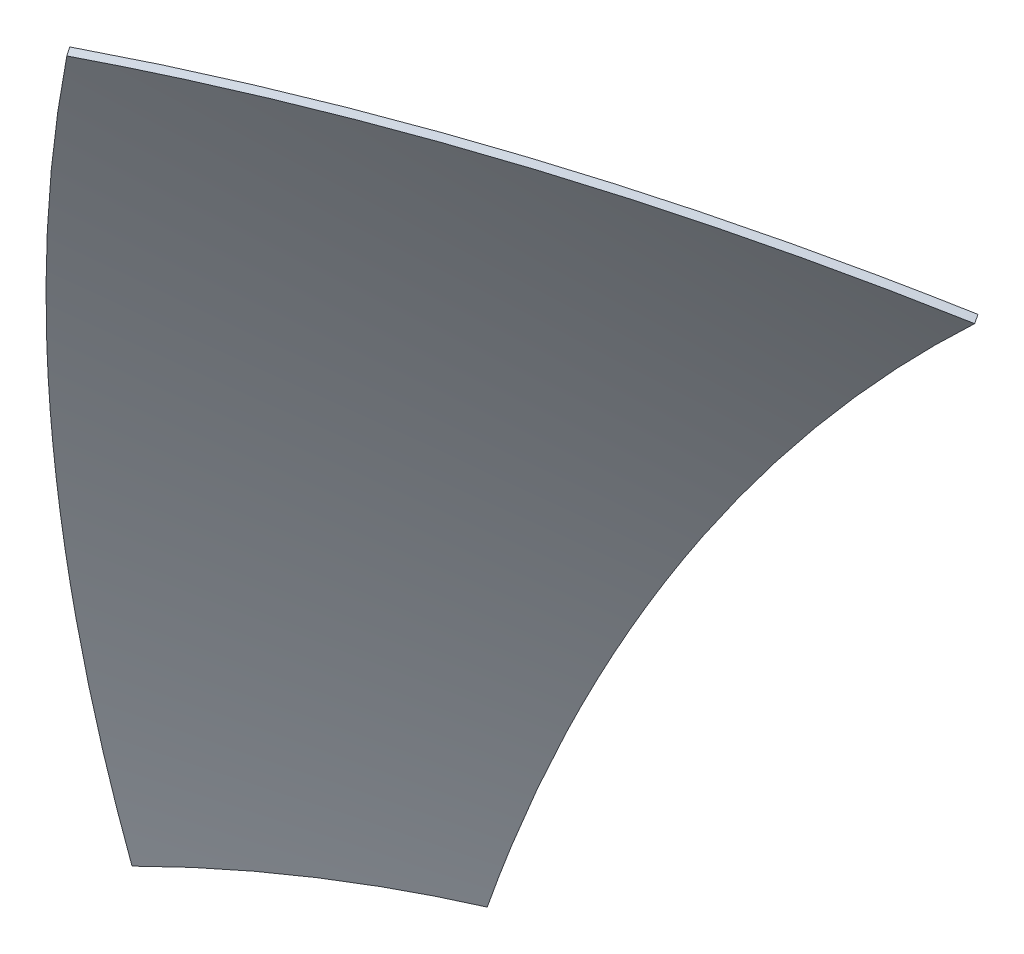
ISO-10303-21;
HEADER;
FILE_DESCRIPTION(('STEP AP214'),'2;1');
FILE_NAME('part.step','',(''),(''),'','','');
FILE_SCHEMA(('AUTOMOTIVE_DESIGN { 1 0 10303 214 1 1 1 1 }'));
ENDSEC;
DATA;
#1=APPLICATION_CONTEXT('core data for automotive mechanical design processes');
#2=APPLICATION_PROTOCOL_DEFINITION('international standard','automotive_design',2000,#1);
#3=PRODUCT_CONTEXT('',#1,'mechanical');
#4=PRODUCT('Part','Part','',(#3));
#5=PRODUCT_RELATED_PRODUCT_CATEGORY('part','',(#4));
#6=PRODUCT_DEFINITION_FORMATION('','',#4);
#7=PRODUCT_DEFINITION_CONTEXT('part definition',#1,'design');
#8=PRODUCT_DEFINITION('design','',#6,#7);
#9=PRODUCT_DEFINITION_SHAPE('','',#8);
#10=(LENGTH_UNIT() NAMED_UNIT(*) SI_UNIT(.MILLI.,.METRE.));
#11=(NAMED_UNIT(*) PLANE_ANGLE_UNIT() SI_UNIT($,.RADIAN.));
#12=(NAMED_UNIT(*) SI_UNIT($,.STERADIAN.) SOLID_ANGLE_UNIT());
#13=UNCERTAINTY_MEASURE_WITH_UNIT(LENGTH_MEASURE(1.E-05),#10,'distance_accuracy_value','');
#14=(GEOMETRIC_REPRESENTATION_CONTEXT(3) GLOBAL_UNCERTAINTY_ASSIGNED_CONTEXT((#13)) GLOBAL_UNIT_ASSIGNED_CONTEXT((#10,
#11,#12)) REPRESENTATION_CONTEXT('',''));
#15=CARTESIAN_POINT('',(0.,0.,0.));
#16=DIRECTION('',(0.,0.,1.));
#17=DIRECTION('',(1.,0.,0.));
#18=AXIS2_PLACEMENT_3D('',#15,#16,#17);
#19=CARTESIAN_POINT('',(172.872009727475,-136.100050866255,-2.70380006520976));
#20=DIRECTION('',(0.,0.,1.));
#21=DIRECTION('',(1.,0.,0.));
#22=AXIS2_PLACEMENT_3D('',#19,#20,#21);
#23=CONICAL_SURFACE('',#22,60.5897364806193,0.959931088596881);
#24=CARTESIAN_POINT('',(125.849998580381,-98.0097647694244,-2.75685890943693));
#25=CARTESIAN_POINT('',(125.802806108054,-98.13289418441,-2.78545031005122));
#26=CARTESIAN_POINT('',(125.756061819432,-98.2561868985266,-2.81408465069162));
#27=CARTESIAN_POINT('',(125.524566386262,-98.8734953138719,-2.95747722445125));
#28=CARTESIAN_POINT('',(125.346546683373,-99.3699071881128,-3.07286594452157));
#29=CARTESIAN_POINT('',(125.004930350756,-100.36738299773,-3.30487100261232));
#30=CARTESIAN_POINT('',(124.841333705168,-100.868446927991,-3.42148733928278));
#31=CARTESIAN_POINT('',(124.606824293059,-101.623178408865,-3.5972582691083));
#32=CARTESIAN_POINT('',(124.530471383772,-101.875268739663,-3.6559874514854));
#33=CARTESIAN_POINT('',(124.30684921741,-102.633106619988,-3.83260237197292));
#34=CARTESIAN_POINT('',(124.165028565446,-103.140384167133,-3.95090689832531));
#35=CARTESIAN_POINT('',(123.963299347978,-103.903964340939,-4.12913701152559));
#36=CARTESIAN_POINT('',(123.897892108323,-104.158925603039,-4.18867372985469));
#37=CARTESIAN_POINT('',(123.70717305496,-104.925148816877,-4.36768239152716));
#38=CARTESIAN_POINT('',(123.587374397705,-105.437712673303,-4.48754409217228));
#39=CARTESIAN_POINT('',(123.41882289238,-106.208763313568,-4.66806910878462));
#40=CARTESIAN_POINT('',(123.364498601842,-106.466138137804,-4.72836395494921));
#41=CARTESIAN_POINT('',(123.20712062133,-107.239367754705,-4.90963681962026));
#42=CARTESIAN_POINT('',(123.109670786163,-107.756289353954,-5.03099420236332));
#43=CARTESIAN_POINT('',(122.929747551783,-108.792507583427,-5.2746148598781));
#44=CARTESIAN_POINT('',(122.847274135357,-109.31180421092,-5.39687813360849));
#45=CARTESIAN_POINT('',(122.697256368376,-110.35236790928,-5.64218186063622));
#46=CARTESIAN_POINT('',(122.629712001331,-110.87363497797,-5.76522231307498));
#47=CARTESIAN_POINT('',(122.509545516411,-111.917726239524,-6.01197519331244));
#48=CARTESIAN_POINT('',(122.456923387982,-112.440550431287,-6.1356876206358));
#49=CARTESIAN_POINT('',(122.36660567934,-113.487348977098,-6.38369158076698));
#50=CARTESIAN_POINT('',(122.328910094295,-114.011323330773,-6.50798311338728));
#51=CARTESIAN_POINT('',(122.268469203174,-115.060015587452,-6.75706856771514));
#52=CARTESIAN_POINT('',(122.245723897837,-115.584733490493,-6.88186248944746));
#53=CARTESIAN_POINT('',(122.21522140697,-116.634497066446,-7.13188680947868));
#54=CARTESIAN_POINT('',(122.207464227664,-117.159542739494,-7.25711720795879));
#55=CARTESIAN_POINT('',(122.206854047819,-118.540491045691,-7.58703759582123));
#56=CARTESIAN_POINT('',(122.226477590711,-119.396334529808,-7.79205750479719));
#57=CARTESIAN_POINT('',(122.266237781076,-120.251218893401,-7.99752302693634));
#58=B_SPLINE_CURVE_WITH_KNOTS('',3,(#24,#25,#26,#27,#28,#29,#30,#31,#32,#33,#34,#35,#36,#37,#38,
#39,#40,#41,#42,#43,#44,#45,#46,#47,#48,#49,#50,#51,#52,#53,#54,#55,#56,#57),.UNSPECIFIED.,.F.,
.F.,(4,2,2,2,2,2,2,2,2,2,2,2,2,2,2,2,4),(0.,0.404785719259704,2.02408034318521,3.64337318660384,
4.45295943477973,6.07225112742958,6.8818373497473,8.50112955325486,9.31071594741061,
10.930009830607,12.5493018526975,14.168592086213,15.7878811744452,17.407169738383,
19.0264583821332,20.6457476982453,23.2857198233411),.UNSPECIFIED.);
#59=CARTESIAN_POINT('',(125.849998580381,-98.0097647694244,-2.75685890943717));
#60=VERTEX_POINT('',#59);
#61=CARTESIAN_POINT('',(122.266237781076,-120.251218893401,-7.99752302693643));
#62=VERTEX_POINT('',#61);
#63=EDGE_CURVE('E24',#60,#62,#58,.T.);
#64=ORIENTED_EDGE('',*,*,#63,.T.);
#65=CARTESIAN_POINT('',(122.266237781076,-120.251218893401,-7.99752302693644));
#66=CARTESIAN_POINT('',(122.378834222942,-120.230350592133,-8.06839270908249));
#67=CARTESIAN_POINT('',(122.491517403282,-120.210827804477,-8.13954595753023));
#68=CARTESIAN_POINT('',(123.055555490295,-120.119817129517,-8.49686090490556));
#69=CARTESIAN_POINT('',(123.507782583896,-120.068331067844,-8.78704423252385));
#70=CARTESIAN_POINT('',(124.223882396153,-120.019047829316,-9.25266430868717));
#71=CARTESIAN_POINT('',(124.488351616915,-120.00785558515,-9.4259560292551));
#72=CARTESIAN_POINT('',(124.864628902835,-120.001724665476,-9.67445744911121));
#73=CARTESIAN_POINT('',(124.97689869284,-120.001143352245,-9.74885104371517));
#74=CARTESIAN_POINT('',(125.475564833004,-120.004076503657,-10.0804026850154));
#75=CARTESIAN_POINT('',(125.860747708995,-120.021087853066,-10.3394946224087));
#76=CARTESIAN_POINT('',(126.35460444555,-120.061763817469,-10.6757424971132));
#77=CARTESIAN_POINT('',(126.465478529002,-120.072134833643,-10.7514987942407));
#78=CARTESIAN_POINT('',(126.949766163138,-120.122874819221,-11.083580757449));
#79=CARTESIAN_POINT('',(127.320934199319,-120.175962365991,-11.3411894895934));
#80=CARTESIAN_POINT('',(127.689117275119,-120.24301357727,-11.5999996128498));
#81=B_SPLINE_CURVE_WITH_KNOTS('',3,(#65,#66,#67,#68,#69,#70,#71,#72,#73,#74,#75,#76,#77,#78,#79,
#80),.UNSPECIFIED.,.F.,.F.,(4,2,2,2,2,2,2,4),(0.,0.404039967201591,2.02138933713423,
2.97026784667452,3.37430460638402,4.76665393129961,5.17069019074547,6.53488990231731),.UNSPECIFIED.);
#82=CARTESIAN_POINT('',(127.689117277392,-120.243013577684,-11.5999996144474));
#83=VERTEX_POINT('',#82);
#84=EDGE_CURVE('E119',#62,#83,#81,.T.);
#85=ORIENTED_EDGE('',*,*,#84,.T.);
#86=CARTESIAN_POINT('',(127.68911727943,-120.243013578765,-11.599999616045));
#87=CARTESIAN_POINT('',(127.734249352296,-120.114414370192,-11.5999996494661));
#88=CARTESIAN_POINT('',(127.779938252751,-119.986008045044,-11.6000047399863));
#89=CARTESIAN_POINT('',(128.011179527202,-119.344894596544,-11.6000530761268));
#90=CARTESIAN_POINT('',(128.205047341229,-118.835157335904,-11.6001649766074));
#91=CARTESIAN_POINT('',(128.610185232068,-117.822665557507,-11.6004735845135));
#92=CARTESIAN_POINT('',(128.821455285935,-117.319911030543,-11.6006702918273));
#93=CARTESIAN_POINT('',(129.261087085438,-116.321926930714,-11.6010958966154));
#94=CARTESIAN_POINT('',(129.489448812089,-115.826697349492,-11.6013247940541));
#95=CARTESIAN_POINT('',(129.96293679863,-114.844325152598,-11.6017712994756));
#96=CARTESIAN_POINT('',(130.208063043527,-114.357182529694,-11.6019889074686));
#97=CARTESIAN_POINT('',(130.714762263948,-113.391511599134,-11.602378996813));
#98=CARTESIAN_POINT('',(130.976335228427,-112.912983285692,-11.6025514781948));
#99=CARTESIAN_POINT('',(131.380740406832,-112.202123789558,-11.6027589088285));
#100=CARTESIAN_POINT('',(131.517541995298,-111.966338741817,-11.6028195019009));
#101=CARTESIAN_POINT('',(131.933963088842,-111.2624508287,-11.6029726866687));
#102=CARTESIAN_POINT('',(132.219570646563,-110.797866918605,-11.603036664634));
#103=CARTESIAN_POINT('',(132.806377590582,-109.878674419631,-11.6030799623007));
#104=CARTESIAN_POINT('',(133.107576975348,-109.424065829771,-11.6030592820104));
#105=CARTESIAN_POINT('',(133.725243721685,-108.525319356074,-11.6029358242954));
#106=CARTESIAN_POINT('',(134.041711085293,-108.081181473635,-11.6028330468597));
#107=CARTESIAN_POINT('',(134.527550376957,-107.423287256838,-11.6026274061342));
#108=CARTESIAN_POINT('',(134.691344029307,-107.205386170222,-11.6025502856886));
#109=CARTESIAN_POINT('',(135.188295663674,-106.555844505934,-11.6022970817994));
#110=CARTESIAN_POINT('',(135.526989914516,-106.128413814873,-11.602099167825));
#111=CARTESIAN_POINT('',(136.218737103603,-105.285355659203,-11.6016733387507));
#112=CARTESIAN_POINT('',(136.571790051981,-104.869728202923,-11.6014454236294));
#113=CARTESIAN_POINT('',(137.291906994172,-104.050770040237,-11.6009981951405));
#114=CARTESIAN_POINT('',(137.658971000982,-103.64743934524,-11.6007788817808));
#115=CARTESIAN_POINT('',(138.219736601336,-103.052111604913,-11.6004924206064));
#116=CARTESIAN_POINT('',(138.408342783616,-102.855290931392,-11.6004040220396));
#117=CARTESIAN_POINT('',(139.080108514551,-102.166221744012,-11.600129637712));
#118=CARTESIAN_POINT('',(139.572336531949,-101.682803842599,-11.6000013307997));
#119=CARTESIAN_POINT('',(140.074997158891,-101.210290648039,-11.5999996160448));
#120=B_SPLINE_CURVE_WITH_KNOTS('',3,(#86,#87,#88,#89,#90,#91,#92,#93,#94,#95,#96,#97,#98,#99,
#100,#101,#102,#103,#104,#105,#106,#107,#108,#109,#110,#111,#112,#113,#114,#115,#116,#117,#118,
#119),.UNSPECIFIED.,.F.,.F.,(4,2,2,2,2,2,2,2,2,2,2,2,2,2,2,2,4),(0.,0.408872020829397,
2.04458807106748,3.68030196459463,5.31601404114307,6.95172465472125,8.58743416988309,
9.40520007344816,11.0409086399157,12.6766170456451,14.3123256695421,15.1300915994072,
16.7658012573591,18.4015120695543,20.0372243991629,20.8549909248611,22.9242005441195),.UNSPECIFIED.);
#121=CARTESIAN_POINT('',(140.074997162066,-101.210290630445,-11.5999996085914));
#122=VERTEX_POINT('',#121);
#123=EDGE_CURVE('E69',#83,#122,#120,.T.);
#124=ORIENTED_EDGE('',*,*,#123,.T.);
#125=CARTESIAN_POINT('',(140.074997165241,-101.210290612852,-11.599999601138));
#126=CARTESIAN_POINT('',(139.971671846861,-101.164192572873,-11.5269277914604));
#127=CARTESIAN_POINT('',(139.868101465494,-101.118535482946,-11.4539216044304));
#128=CARTESIAN_POINT('',(139.556638478958,-100.982909679447,-11.2350972452105));
#129=CARTESIAN_POINT('',(139.348010107883,-100.894293781359,-11.0894847203606));
#130=CARTESIAN_POINT('',(139.033579860466,-100.764188168887,-10.8715020800617));
#131=CARTESIAN_POINT('',(138.928514490968,-100.721286459424,-10.7989088714516));
#132=CARTESIAN_POINT('',(138.717892296498,-100.636437223275,-10.653873130143));
#133=CARTESIAN_POINT('',(138.612335462439,-100.594489714315,-10.5814306002664));
#134=CARTESIAN_POINT('',(138.294404263008,-100.4699239803,-10.3639898982521));
#135=CARTESIAN_POINT('',(138.081279628189,-100.388794046213,-10.2192325775908));
#136=CARTESIAN_POINT('',(137.653173728724,-100.230397184013,-9.93034209685028));
#137=CARTESIAN_POINT('',(137.438192407357,-100.153130374411,-9.78620895604294));
#138=CARTESIAN_POINT('',(137.006595100958,-100.00214775947,-9.49848796829979));
#139=CARTESIAN_POINT('',(136.789978978452,-99.9284322567019,-9.35490016878374));
#140=CARTESIAN_POINT('',(136.355062537288,-99.7848411847027,-9.0683571515393));
#141=CARTESIAN_POINT('',(136.136762229392,-99.7149655909574,-8.92540192977787));
#142=CARTESIAN_POINT('',(135.698464684269,-99.5792569327572,-8.640182332777));
#143=CARTESIAN_POINT('',(135.478467480166,-99.5134237896202,-8.49791794414089));
#144=CARTESIAN_POINT('',(135.036805261365,-99.3859207099215,-8.21411679592477));
#145=CARTESIAN_POINT('',(134.81514023296,-99.324250807618,-8.07258004234117));
#146=CARTESIAN_POINT('',(134.147817489284,-99.1455108858595,-7.64910400827855));
#147=CARTESIAN_POINT('',(133.699767531944,-99.0346906461966,-7.36825694497205));
#148=CARTESIAN_POINT('',(133.024093881958,-98.8809512207299,-6.94954878843575));
#149=CARTESIAN_POINT('',(132.798543393421,-98.8318382406183,-6.81057234613201));
#150=CARTESIAN_POINT('',(132.346159857238,-98.7377237111563,-6.53337345461164));
#151=CARTESIAN_POINT('',(132.119326959107,-98.6927216925994,-6.39515092104481));
#152=CARTESIAN_POINT('',(131.436963130596,-98.5638821209821,-5.98159082117687));
#153=CARTESIAN_POINT('',(130.979577557827,-98.4862134382851,-5.70736725357982));
#154=CARTESIAN_POINT('',(130.060445422101,-98.3475534414437,-5.16201669513596));
#155=CARTESIAN_POINT('',(129.598698849129,-98.2865621656057,-4.89088971140309));
#156=CARTESIAN_POINT('',(128.903254804394,-98.2078885089676,-4.48668140266594));
#157=CARTESIAN_POINT('',(128.67098100464,-98.1838003758082,-4.35236558823702));
#158=CARTESIAN_POINT('',(128.009864117983,-98.1215212748924,-3.97199692736606));
#159=CARTESIAN_POINT('',(127.579942357154,-98.0885005405691,-3.72694476190712));
#160=CARTESIAN_POINT('',(126.717046603895,-98.0376117571303,-3.23966310089245));
#161=CARTESIAN_POINT('',(126.284070000175,-98.0197588173004,-2.99743665642981));
#162=CARTESIAN_POINT('',(125.849998580381,-98.0097647694243,-2.75685890943753));
#163=B_SPLINE_CURVE_WITH_KNOTS('',3,(#125,#126,#127,#128,#129,#130,#131,#132,#133,#134,#135,
#136,#137,#138,#139,#140,#141,#142,#143,#144,#145,#146,#147,#148,#149,#150,#151,#152,#153,#154,
#155,#156,#157,#158,#159,#160,#161,#162),.UNSPECIFIED.,.F.,.F.,(4,2,2,2,2,2,2,2,2,2,2,2,2,2,2,2,
2,2,4),(0.,0.404064073645264,1.21225538975873,1.61640711270501,2.0205663373726,2.83085305035249,
3.64116460560685,4.45154507775997,5.26192037582597,6.07227989579173,6.8826460832132,
8.50313977573195,9.31144165049465,10.1196511537601,11.7361078506468,13.3525682603534,
14.1607183797807,15.6483280666406,17.1374178931225),.UNSPECIFIED.);
#164=EDGE_CURVE('E66',#122,#60,#163,.T.);
#165=ORIENTED_EDGE('',*,*,#164,.T.);
#166=EDGE_LOOP('',(#64,#85,#124,#165));
#167=FACE_BOUND('',#166,.T.);
#168=ADVANCED_FACE('F17',(#167),#23,.F.);
#169=CARTESIAN_POINT('',(122.155670900579,-120.216591303635,-8.16299173988276));
#170=CARTESIAN_POINT('',(122.156035807775,-120.216705586109,-8.1624456385199));
#171=CARTESIAN_POINT('',(122.156400714972,-120.216819868584,-8.16189953715704));
#172=CARTESIAN_POINT('',(122.156765622168,-120.216934151058,-8.16135343579418));
#173=CARTESIAN_POINT('',(122.193256341804,-120.228362398506,-8.10674329950825));
#174=CARTESIAN_POINT('',(122.22974706144,-120.239790645953,-8.05213316322232));
#175=CARTESIAN_POINT('',(122.266237781076,-120.251218893401,-7.99752302693639));
#176=CARTESIAN_POINT('',(121.957949452135,-115.901699881147,-7.12789737510281));
#177=CARTESIAN_POINT('',(121.958305630485,-115.901842049585,-7.12735127373995));
#178=CARTESIAN_POINT('',(121.958661808835,-115.901984218022,-7.12680517237709));
#179=CARTESIAN_POINT('',(121.959017987185,-115.90212638646,-7.12625907101423));
#180=CARTESIAN_POINT('',(121.994635822177,-115.916343230233,-7.0716489347283));
#181=CARTESIAN_POINT('',(122.030254068203,-115.93055440918,-7.01703879844237));
#182=CARTESIAN_POINT('',(122.065871903196,-115.944771252953,-6.96242866215644));
#183=CARTESIAN_POINT('',(122.509266157602,-108.239848419767,-5.31571933886036));
#184=CARTESIAN_POINT('',(122.509601950313,-108.24003598325,-5.3151732374975));
#185=CARTESIAN_POINT('',(122.509937743023,-108.240223546734,-5.31462713613464));
#186=CARTESIAN_POINT('',(122.510273535734,-108.240411110218,-5.31408103477178));
#187=CARTESIAN_POINT('',(122.543852806785,-108.259167458594,-5.25947089848585));
#188=CARTESIAN_POINT('',(122.577431670557,-108.277926071453,-5.20486076219992));
#189=CARTESIAN_POINT('',(122.611010941608,-108.296682419828,-5.15025062591399));
#190=CARTESIAN_POINT('',(124.610925355273,-100.929744474195,-3.61624611019748));
#191=CARTESIAN_POINT('',(124.611234587475,-100.929970225461,-3.61570000883462));
#192=CARTESIAN_POINT('',(124.611543819676,-100.930195976728,-3.61515390747176));
#193=CARTESIAN_POINT('',(124.611853051878,-100.930421727995,-3.6146078061089));
#194=CARTESIAN_POINT('',(124.64277627205,-100.952996854675,-3.55999766982297));
#195=CARTESIAN_POINT('',(124.673699727548,-100.975571198893,-3.50538753353703));
#196=CARTESIAN_POINT('',(124.704622947719,-100.998146325572,-3.4507773972511));
#197=CARTESIAN_POINT('',(125.759968364243,-97.9368355899539,-2.92232762238331));
#198=CARTESIAN_POINT('',(125.76026549367,-97.9370762803152,-2.92178152102045));
#199=CARTESIAN_POINT('',(125.760562623096,-97.9373169706765,-2.92123541965759));
#200=CARTESIAN_POINT('',(125.760859752522,-97.9375576610378,-2.92068931829473));
#201=CARTESIAN_POINT('',(125.790572695142,-97.9616266971667,-2.8660791820088));
#202=CARTESIAN_POINT('',(125.820285637761,-97.9856957332955,-2.81146904572286));
#203=CARTESIAN_POINT('',(125.849998580381,-98.0097647694244,-2.75685890943693));
#204=B_SPLINE_SURFACE_WITH_KNOTS('',3,3,((#169,#170,#171,#172,#173,#174,#175),(#176,#177,#178,
#179,#180,#181,#182),(#183,#184,#185,#186,#187,#188,#189),(#190,#191,#192,#193,#194,#195,#196),
(#197,#198,#199,#200,#201,#202,#203)),.UNSPECIFIED.,.F.,.F.,.F.,(4,1,4),(4,3,4),(0.,
0.571428571428571,1.),(-0.01,0.,1.),.UNSPECIFIED.);
#205=DIRECTION('',(0.547360794539463,-0.171423711719821,0.819152044288072));
#206=VECTOR('',#205,1.);
#207=CARTESIAN_POINT('',(122.212049062417,-120.234247945941,-8.078619079321));
#208=LINE('',#207,#206);
#209=CARTESIAN_POINT('',(122.159304545487,-120.217728671679,-8.15755361789322));
#210=VERTEX_POINT('',#209);
#211=EDGE_CURVE('E78',#210,#62,#208,.T.);
#212=DIRECTION('',(-0.445694139286622,0.361035541933279,-0.81915204429123));
#213=VECTOR('',#212,1.);
#214=CARTESIAN_POINT('',(125.805429166452,-97.9736612152311,-2.83877411386609));
#215=LINE('',#214,#213);
#216=CARTESIAN_POINT('',(125.760859743603,-97.937557660841,-2.92068931335484));
#217=VERTEX_POINT('',#216);
#218=EDGE_CURVE('E73',#60,#217,#215,.T.);
#219=CARTESIAN_POINT('',(122.159304516256,-120.217728037305,-8.1575534659389));
#220=CARTESIAN_POINT('',(122.153324246952,-120.087941901877,-8.12646529417039));
#221=CARTESIAN_POINT('',(122.14780794087,-119.958130530187,-8.09538662470399));
#222=CARTESIAN_POINT('',(122.122541537477,-119.308918904987,-7.94003112529178));
#223=CARTESIAN_POINT('',(122.109743619487,-118.789194642967,-7.81590145391037));
#224=CARTESIAN_POINT('',(122.098905478222,-117.74952145904,-7.56799539824963));
#225=CARTESIAN_POINT('',(122.100865240078,-117.229572537359,-7.44421901361446));
#226=CARTESIAN_POINT('',(122.119482001185,-116.18983697441,-7.19705656212203));
#227=CARTESIAN_POINT('',(122.136138990683,-115.670050333035,-7.07367049500585));
#228=CARTESIAN_POINT('',(122.184102769395,-114.631069587072,-6.82735223235055));
#229=CARTESIAN_POINT('',(122.215409553952,-114.111875482296,-6.70442003666719));
#230=CARTESIAN_POINT('',(122.331293199647,-112.555328999155,-6.33629757912645));
#231=CARTESIAN_POINT('',(122.437828047128,-111.519307470136,-6.09185154278126));
#232=CARTESIAN_POINT('',(122.641438036179,-109.970934648462,-5.72736094358116));
#233=CARTESIAN_POINT('',(122.716595623074,-109.455825913936,-5.60624409169105));
#234=CARTESIAN_POINT('',(122.881545038144,-108.427733041591,-5.36481215020711));
#235=CARTESIAN_POINT('',(122.971336883008,-107.914748906196,-5.24449706152774));
#236=CARTESIAN_POINT('',(123.117018955026,-107.147247292086,-5.06474047492168));
#237=CARTESIAN_POINT('',(123.167410014891,-106.891751694755,-5.0049430967766));
#238=CARTESIAN_POINT('',(123.324072904931,-106.126246054495,-4.82589534309327));
#239=CARTESIAN_POINT('',(123.435827933279,-105.617254360738,-4.70699807080837));
#240=CARTESIAN_POINT('',(123.614293078245,-104.856203860931,-4.52939737235408));
#241=CARTESIAN_POINT('',(123.675584465495,-104.602935709137,-4.47032347794018));
#242=CARTESIAN_POINT('',(123.991146973321,-103.338263553802,-4.17546984850457));
#243=CARTESIAN_POINT('',(124.27248273097,-102.332963643998,-3.94149399451808));
#244=CARTESIAN_POINT('',(124.759974802808,-100.763763490638,-3.57668756678388));
#245=CARTESIAN_POINT('',(124.947130197488,-100.194193333045,-3.44436154445767));
#246=CARTESIAN_POINT('',(125.340052604147,-99.0611680040062,-3.18130287676404));
#247=CARTESIAN_POINT('',(125.545818776349,-98.4977125579291,-3.05057015980355));
#248=CARTESIAN_POINT('',(125.760859732681,-97.9375577127195,-2.92068933027751));
#249=B_SPLINE_CURVE_WITH_KNOTS('',3,(#219,#220,#221,#222,#223,#224,#225,#226,#227,#228,#229,
#230,#231,#232,#233,#234,#235,#236,#237,#238,#239,#240,#241,#242,#243,#244,#245,#246,#247,#248),
.UNSPECIFIED.,.F.,.F.,(4,2,2,2,2,2,2,2,2,2,2,2,2,2,4),(0.,0.400777839765909,2.00403361712834,
3.60728777910773,5.21054087728743,6.81379346584936,10.0212073204717,11.6244618026775,
13.2277181131932,14.0292884719849,15.6325454264526,16.4341155511472,19.6415516112059,
21.4831723036834,23.3247099380154),.UNSPECIFIED.);
#250=EDGE_CURVE('E113',#210,#217,#249,.T.);
#251=ORIENTED_EDGE('',*,*,#211,.T.);
#252=ORIENTED_EDGE('',*,*,#63,.F.);
#253=ORIENTED_EDGE('',*,*,#218,.T.);
#254=ORIENTED_EDGE('',*,*,#250,.F.);
#255=EDGE_LOOP('',(#251,#252,#253,#254));
#256=FACE_BOUND('',#255,.T.);
#257=ADVANCED_FACE('F75',(#256),#204,.F.);
#258=CARTESIAN_POINT('',(125.759968364244,-97.9368355899539,-2.92232762238349));
#259=CARTESIAN_POINT('',(125.760265493671,-97.9370762803152,-2.92178152102063));
#260=CARTESIAN_POINT('',(125.760562623097,-97.9373169706765,-2.92123541965777));
#261=CARTESIAN_POINT('',(125.760859752523,-97.9375576610378,-2.92068931829491));
#262=CARTESIAN_POINT('',(125.790572695142,-97.9616266971666,-2.86607918200903));
#263=CARTESIAN_POINT('',(125.820285637762,-97.9856957332955,-2.81146904572315));
#264=CARTESIAN_POINT('',(125.849998580381,-98.0097647694244,-2.75685890943728));
#265=CARTESIAN_POINT('',(125.850298681101,-98.0100078666893,-2.75630734706079));
#266=CARTESIAN_POINT('',(125.850598781822,-98.0102509639542,-2.7557557846843));
#267=CARTESIAN_POINT('',(125.850898882542,-98.0104940612191,-2.75520422230782));
#268=CARTESIAN_POINT('',(128.715320554766,-98.0020094879843,-4.55903629348519));
#269=CARTESIAN_POINT('',(128.715610500469,-98.0022590552341,-4.55849019212233));
#270=CARTESIAN_POINT('',(128.715900446172,-98.002508622484,-4.55794409075947));
#271=CARTESIAN_POINT('',(128.716190391875,-98.0027581897338,-4.55739798939661));
#272=CARTESIAN_POINT('',(128.745184962184,-98.0277149147181,-4.50278785311073));
#273=CARTESIAN_POINT('',(128.774179514774,-98.0526690615698,-4.44817771682483));
#274=CARTESIAN_POINT('',(128.803174085083,-98.0776257865541,-4.39356758053895));
#275=CARTESIAN_POINT('',(128.803466930243,-98.0778778494764,-4.39301601816246));
#276=CARTESIAN_POINT('',(128.803759775403,-98.0781299123988,-4.39246445578598));
#277=CARTESIAN_POINT('',(128.804052620563,-98.0783819753211,-4.39191289340949));
#278=CARTESIAN_POINT('',(132.68372515011,-98.594150604768,-6.90067145038368));
#279=CARTESIAN_POINT('',(132.684005243807,-98.5944111746842,-6.90012534902082));
#280=CARTESIAN_POINT('',(132.684285337504,-98.5946717446004,-6.89957924765796));
#281=CARTESIAN_POINT('',(132.684565431201,-98.5949323145166,-6.8990331462951));
#282=CARTESIAN_POINT('',(132.712574800895,-98.6209893061368,-6.84442301000919));
#283=CARTESIAN_POINT('',(132.740585196888,-98.6470451876773,-6.7898128737233));
#284=CARTESIAN_POINT('',(132.768594566582,-98.6731021792976,-6.73520273743739));
#285=CARTESIAN_POINT('',(132.768877461216,-98.673365354913,-6.7346511750609));
#286=CARTESIAN_POINT('',(132.76916035585,-98.6736285305283,-6.73409961268441));
#287=CARTESIAN_POINT('',(132.769443250484,-98.6738917061437,-6.73354805030793));
#288=CARTESIAN_POINT('',(136.469547168482,-99.747907639557,-9.35521144096392));
#289=CARTESIAN_POINT('',(136.469817817906,-99.7481777896856,-9.35466533960106));
#290=CARTESIAN_POINT('',(136.47008846733,-99.7484479398142,-9.3541192382382));
#291=CARTESIAN_POINT('',(136.470359116754,-99.7487180899428,-9.35357313687534));
#292=CARTESIAN_POINT('',(136.497424059157,-99.7757331028049,-9.29896300058942));
#293=CARTESIAN_POINT('',(136.524487093416,-99.8027502876181,-9.24435286430351));
#294=CARTESIAN_POINT('',(136.551552035819,-99.8297653004802,-9.18974272801759));
#295=CARTESIAN_POINT('',(136.551825391737,-99.8300381521101,-9.1891911656411));
#296=CARTESIAN_POINT('',(136.552098747655,-99.83031100374,-9.18863960326462));
#297=CARTESIAN_POINT('',(136.552372103574,-99.8305838553699,-9.18808804088813));
#298=CARTESIAN_POINT('',(138.40617016468,-100.449425317283,-10.6557977383047));
#299=CARTESIAN_POINT('',(138.406435984249,-100.449700213942,-10.6552516369418));
#300=CARTESIAN_POINT('',(138.406701803818,-100.449975110602,-10.654705535579));
#301=CARTESIAN_POINT('',(138.406967623388,-100.450250007262,-10.6541594342161));
#302=CARTESIAN_POINT('',(138.433549580337,-100.477739673241,-10.5995492979301));
#303=CARTESIAN_POINT('',(138.460133543102,-100.505226820478,-10.5449391616442));
#304=CARTESIAN_POINT('',(138.48671550005,-100.532716486458,-10.4903290253583));
#305=CARTESIAN_POINT('',(138.486983977815,-100.532994132084,-10.4897774629818));
#306=CARTESIAN_POINT('',(138.48725245558,-100.533271777711,-10.4892259006053));
#307=CARTESIAN_POINT('',(138.487520933346,-100.533549423337,-10.4886743382288));
#308=CARTESIAN_POINT('',(139.361180418864,-100.843466999897,-11.3171126533402));
#309=CARTESIAN_POINT('',(139.361443891858,-100.843744133409,-11.3165665519773));
#310=CARTESIAN_POINT('',(139.361707364851,-100.844021266922,-11.3160204506145));
#311=CARTESIAN_POINT('',(139.361970837845,-100.844298400434,-11.3154743492516));
#312=CARTESIAN_POINT('',(139.388318137207,-100.872011751684,-11.2608642129657));
#313=CARTESIAN_POINT('',(139.41466216463,-100.899728933895,-11.2062540766797));
#314=CARTESIAN_POINT('',(139.441009463991,-100.927442285145,-11.1516439403938));
#315=CARTESIAN_POINT('',(139.441275571715,-100.927722189993,-11.1510923780173));
#316=CARTESIAN_POINT('',(139.441541679438,-100.92800209484,-11.1505408156408));
#317=CARTESIAN_POINT('',(139.441807787162,-100.928281999688,-11.1499892532643));
#318=CARTESIAN_POINT('',(139.995640993928,-101.125870800371,-11.7654683091632));
#319=CARTESIAN_POINT('',(139.995902895461,-101.126149413603,-11.7649222078003));
#320=CARTESIAN_POINT('',(139.996164796993,-101.126428026836,-11.7643761064375));
#321=CARTESIAN_POINT('',(139.996426698526,-101.126706640068,-11.7638300050746));
#322=CARTESIAN_POINT('',(140.022616851778,-101.154567963295,-11.7092198687886));
#323=CARTESIAN_POINT('',(140.04880700503,-101.182429286521,-11.6546097325027));
#324=CARTESIAN_POINT('',(140.074997158282,-101.210290609747,-11.5999995962168));
#325=CARTESIAN_POINT('',(140.07526167883,-101.210572009112,-11.5994480338403));
#326=CARTESIAN_POINT('',(140.075526199378,-101.210853408476,-11.5988964714638));
#327=CARTESIAN_POINT('',(140.075790719926,-101.211134807841,-11.5983449090873));
#328=B_SPLINE_SURFACE_WITH_KNOTS('',3,3,((#258,#259,#260,#261,#262,#263,#264,#265,#266,#267),
(#268,#269,#270,#271,#272,#273,#274,#275,#276,#277),(#278,#279,#280,#281,#282,#283,#284,#285,
#286,#287),(#288,#289,#290,#291,#292,#293,#294,#295,#296,#297),(#298,#299,#300,#301,#302,#303,
#304,#305,#306,#307),(#308,#309,#310,#311,#312,#313,#314,#315,#316,#317),(#318,#319,#320,#321,
#322,#323,#324,#325,#326,#327)),.UNSPECIFIED.,.F.,.F.,.F.,(4,1,1,1,4),(4,3,3,4),(0.,
0.571428571428571,0.785714285714286,0.857142857142857,1.),(-0.01,0.,1.,1.0101),.UNSPECIFIED.);
#329=DIRECTION('',(-0.392852299013213,0.417919848175582,-0.819152044287831));
#330=VECTOR('',#329,1.);
#331=CARTESIAN_POINT('',(140.035010033119,-101.167752016015,-11.6833783341684));
#332=LINE('',#331,#330);
#333=CARTESIAN_POINT('',(139.996664016307,-101.12695926321,-11.7633350556306));
#334=VERTEX_POINT('',#333);
#335=EDGE_CURVE('E84',#122,#334,#332,.T.);
#336=CARTESIAN_POINT('',(125.760859734683,-97.9375576606442,-2.92068930841458));
#337=CARTESIAN_POINT('',(125.877495768326,-97.9401314501815,-2.98528436378416));
#338=CARTESIAN_POINT('',(125.994054796951,-97.9432742637817,-3.04999988443977));
#339=CARTESIAN_POINT('',(126.576506665261,-97.9618080451358,-3.37420297603553));
#340=CARTESIAN_POINT('',(127.041175179269,-97.9856544802839,-3.63545947499306));
#341=CARTESIAN_POINT('',(127.968538623493,-98.0507680271909,-4.16211325219261));
#342=CARTESIAN_POINT('',(128.43122506807,-98.0920811070641,-4.42751966416905));
#343=CARTESIAN_POINT('',(129.352933216166,-98.1915883139783,-4.96159957251695));
#344=CARTESIAN_POINT('',(129.811954624066,-98.2497837888839,-5.2302733281066));
#345=CARTESIAN_POINT('',(130.725764974696,-98.3826519183679,-5.77068483079508));
#346=CARTESIAN_POINT('',(131.180554033163,-98.4573241209944,-6.04242249365789));
#347=CARTESIAN_POINT('',(132.085340184196,-98.6228985017275,-6.58883331461116));
#348=CARTESIAN_POINT('',(132.535337746405,-98.7137990733883,-6.86350617961819));
#349=CARTESIAN_POINT('',(133.205680260354,-98.8621384057863,-7.27729574867544));
#350=CARTESIAN_POINT('',(133.428052677152,-98.9135049180718,-7.41533327415779));
#351=CARTESIAN_POINT('',(133.871408104368,-99.0202750661467,-7.69214217601913));
#352=CARTESIAN_POINT('',(134.092390949326,-99.0756791731728,-7.83091363629872));
#353=CARTESIAN_POINT('',(134.532851672455,-99.1905506329548,-8.1091797982114));
#354=CARTESIAN_POINT('',(134.752329494348,-99.250018136756,-8.24867452655162));
#355=CARTESIAN_POINT('',(135.189677017526,-99.3730297817882,-8.52837801089194));
#356=CARTESIAN_POINT('',(135.407546743359,-99.4365738606415,-8.66858675593631));
#357=CARTESIAN_POINT('',(135.841636310715,-99.5676484513459,-8.94968925086475));
#358=CARTESIAN_POINT('',(136.057856161883,-99.6351789398687,-9.0905829967358));
#359=CARTESIAN_POINT('',(136.488633758894,-99.7740703913912,-9.37300743523818));
#360=CARTESIAN_POINT('',(136.703191543235,-99.8454312653605,-9.51453811299517));
#361=CARTESIAN_POINT('',(137.130727592238,-99.9916826568832,-9.79815991733719));
#362=CARTESIAN_POINT('',(137.343705853785,-100.066573181396,-9.94025104502673));
#363=CARTESIAN_POINT('',(137.762702390888,-100.218068057707,-10.2214768433398));
#364=CARTESIAN_POINT('',(137.968762195937,-100.294583713494,-10.3605973425133));
#365=CARTESIAN_POINT('',(138.379050415175,-100.451324514868,-10.6394461785277));
#366=CARTESIAN_POINT('',(138.583278840635,-100.531549637606,-10.7791745116198));
#367=CARTESIAN_POINT('',(138.99010185144,-100.6956388562,-11.0593317068427));
#368=CARTESIAN_POINT('',(139.192694689774,-100.779506354852,-11.1997611106356));
#369=CARTESIAN_POINT('',(139.596051719818,-100.95068327156,-11.4811555075184));
#370=CARTESIAN_POINT('',(139.796815882617,-101.037992743918,-11.6221205090263));
#371=CARTESIAN_POINT('',(139.996663958246,-101.12695911316,-11.7633349512187));
#372=B_SPLINE_CURVE_WITH_KNOTS('',3,(#336,#337,#338,#339,#340,#341,#342,#343,#344,#345,#346,
#347,#348,#349,#350,#351,#352,#353,#354,#355,#356,#357,#358,#359,#360,#361,#362,#363,#364,#365,
#366,#367,#368,#369,#370,#371),.UNSPECIFIED.,.F.,.F.,(4,2,2,2,2,2,2,2,2,2,2,2,2,2,2,2,2,4),(0.,
0.400064411709241,2.00054432741077,3.60526281103819,5.21010944822085,6.81491207040329,
8.41955592121823,9.21970314858392,10.0199439129471,10.820214440205,11.6204727250546,
12.4207263273003,13.2209613371218,14.0211979247838,14.8015691297141,15.5819355284755,
16.3630473438477,17.1441714873972),.UNSPECIFIED.);
#373=EDGE_CURVE('E81',#217,#334,#372,.T.);
#374=ORIENTED_EDGE('',*,*,#218,.F.);
#375=ORIENTED_EDGE('',*,*,#164,.F.);
#376=ORIENTED_EDGE('',*,*,#335,.T.);
#377=ORIENTED_EDGE('',*,*,#373,.F.);
#378=EDGE_LOOP('',(#374,#375,#376,#377));
#379=FACE_BOUND('',#378,.T.);
#380=ADVANCED_FACE('F79',(#379),#328,.F.);
#381=CARTESIAN_POINT('',(139.995023109454,-101.125213562988,-11.7667566683367));
#382=CARTESIAN_POINT('',(139.995490905298,-101.12571120846,-11.7657812485104));
#383=CARTESIAN_POINT('',(139.995958701141,-101.126208853932,-11.7648058286841));
#384=CARTESIAN_POINT('',(139.996426496984,-101.126706499404,-11.7638304088578));
#385=CARTESIAN_POINT('',(140.022616650251,-101.154567822616,-11.7092202725719));
#386=CARTESIAN_POINT('',(140.048806803517,-101.182429145829,-11.6546101362859));
#387=CARTESIAN_POINT('',(140.074996956783,-101.210290469042,-11.6));
#388=CARTESIAN_POINT('',(140.075263536274,-101.210574058729,-11.5994441444389));
#389=CARTESIAN_POINT('',(140.075530115765,-101.210857648416,-11.5988882888778));
#390=CARTESIAN_POINT('',(140.075796695256,-101.211141238103,-11.5983324333166));
#391=CARTESIAN_POINT('',(134.413230620332,-106.372200136559,-11.7667566683367));
#392=CARTESIAN_POINT('',(134.413777925717,-106.372623186725,-11.7657812485104));
#393=CARTESIAN_POINT('',(134.414325231102,-106.373046236891,-11.7648058286841));
#394=CARTESIAN_POINT('',(134.414872536487,-106.373469287057,-11.7638304088578));
#395=CARTESIAN_POINT('',(134.445514133932,-106.397154295909,-11.7092202725719));
#396=CARTESIAN_POINT('',(134.476140942021,-106.420828833341,-11.6546101362859));
#397=CARTESIAN_POINT('',(134.506782539465,-106.444513842193,-11.6));
#398=CARTESIAN_POINT('',(134.507094428493,-106.444754922783,-11.5994441444389));
#399=CARTESIAN_POINT('',(134.507406317522,-106.444996003373,-11.5988882888778));
#400=CARTESIAN_POINT('',(134.50771820655,-106.445237083964,-11.5983324333166));
#401=CARTESIAN_POINT('',(130.115807738452,-112.975821346272,-11.7667566683367));
#402=CARTESIAN_POINT('',(130.116416195066,-112.976150428596,-11.7657812485104));
#403=CARTESIAN_POINT('',(130.11702465168,-112.97647951092,-11.7648058286841));
#404=CARTESIAN_POINT('',(130.117633108294,-112.976808593244,-11.7638304088578));
#405=CARTESIAN_POINT('',(130.151698336133,-112.995232691338,-11.7092202725719));
#406=CARTESIAN_POINT('',(130.185748000197,-113.013647508019,-11.6546101362859));
#407=CARTESIAN_POINT('',(130.219813228036,-113.032071606112,-11.6));
#408=CARTESIAN_POINT('',(130.220159964881,-113.032259137916,-11.5994441444389));
#409=CARTESIAN_POINT('',(130.220506701725,-113.03244666972,-11.5988882888778));
#410=CARTESIAN_POINT('',(130.22085343857,-113.032634201525,-11.5983324333166));
#411=CARTESIAN_POINT('',(127.57894084019,-120.204346910685,-11.7667566683367));
#412=CARTESIAN_POINT('',(127.57958530039,-120.204573085435,-11.7657812485104));
#413=CARTESIAN_POINT('',(127.580229760589,-120.204799260186,-11.7648058286841));
#414=CARTESIAN_POINT('',(127.580874220789,-120.205025434936,-11.7638304088578));
#415=CARTESIAN_POINT('',(127.616955155776,-120.217688119869,-11.7092202725719));
#416=CARTESIAN_POINT('',(127.653036090763,-120.230350804803,-11.6546101362859));
#417=CARTESIAN_POINT('',(127.689117025751,-120.243013489736,-11.6));
#418=CARTESIAN_POINT('',(127.689484279703,-120.243142378333,-11.5994441444389));
#419=CARTESIAN_POINT('',(127.689851533655,-120.24327126693,-11.5988882888778));
#420=CARTESIAN_POINT('',(127.690218787607,-120.243400155527,-11.5983324333166));
#421=B_SPLINE_SURFACE_WITH_KNOTS('',3,3,((#381,#382,#383,#384,#385,#386,#387,#388,#389,#390),
(#391,#392,#393,#394,#395,#396,#397,#398,#399,#400),(#401,#402,#403,#404,#405,#406,#407,#408,
#409,#410),(#411,#412,#413,#414,#415,#416,#417,#418,#419,#420)),.UNSPECIFIED.,.F.,.F.,.F.,(4,4),
(4,3,3,4),(0.,1.),(-0.0178615160599492,0.,1.,1.0101786151606),.UNSPECIFIED.);
#422=DIRECTION('',(-0.541214024815268,0.189940274008486,-0.819152044282891));
#423=VECTOR('',#422,1.);
#424=CARTESIAN_POINT('',(127.635537086764,-120.224209490162,-11.6810956653056));
#425=LINE('',#424,#423);
#426=CARTESIAN_POINT('',(127.582957498205,-120.205756555481,-11.7606773996093));
#427=VERTEX_POINT('',#426);
#428=EDGE_CURVE('E45',#83,#427,#425,.T.);
#429=CARTESIAN_POINT('',(139.996663972093,-101.126959304763,-11.7633350556399));
#430=CARTESIAN_POINT('',(139.897351021417,-101.220295247723,-11.7633558068636));
#431=CARTESIAN_POINT('',(139.798439246083,-101.314061538517,-11.7633809560977));
#432=CARTESIAN_POINT('',(139.305849204323,-101.785074911829,-11.7635263085439));
#433=CARTESIAN_POINT('',(138.918243479468,-102.168712602808,-11.7637052995402));
#434=CARTESIAN_POINT('',(138.156440454641,-102.949052792269,-11.7641272290204));
#435=CARTESIAN_POINT('',(137.782243137111,-103.345755273642,-11.7643701674206));
#436=CARTESIAN_POINT('',(137.04762587685,-104.15172322056,-11.7648675373785));
#437=CARTESIAN_POINT('',(136.687205918911,-104.560988672237,-11.7651219689235));
#438=CARTESIAN_POINT('',(135.980523678473,-105.391557597006,-11.7655989597031));
#439=CARTESIAN_POINT('',(135.63426138338,-105.812861059388,-11.765821518966));
#440=CARTESIAN_POINT('',(134.956246935268,-106.667003528467,-11.7662009936036));
#441=CARTESIAN_POINT('',(134.624494772542,-107.099842527447,-11.7663579090222));
#442=CARTESIAN_POINT('',(134.138062854117,-107.757298406709,-11.7665266172829));
#443=CARTESIAN_POINT('',(133.977793312522,-107.977804432243,-11.7665717419196));
#444=CARTESIAN_POINT('',(133.50258086933,-108.64341492249,-11.7666708248361));
#445=CARTESIAN_POINT('',(133.193269894922,-109.092565161192,-11.7666884745781));
#446=CARTESIAN_POINT('',(132.59005364692,-110.001072674976,-11.7666185410433));
#447=CARTESIAN_POINT('',(132.296148371768,-110.460429949026,-11.7665309577771));
#448=CARTESIAN_POINT('',(131.72406430418,-111.388856404097,-11.7662530005999));
#449=CARTESIAN_POINT('',(131.44588551376,-111.857925586365,-11.7660626266758));
#450=CARTESIAN_POINT('',(131.040704841986,-112.568342791691,-11.7657099629047));
#451=CARTESIAN_POINT('',(130.907666044777,-112.806271098527,-11.7655812332417));
#452=CARTESIAN_POINT('',(130.514598803456,-113.523461985464,-11.7651653301468));
#453=CARTESIAN_POINT('',(130.260649656586,-114.006079699274,-11.7648484640722));
#454=CARTESIAN_POINT('',(129.769325199212,-114.979660534009,-11.764163552086));
#455=CARTESIAN_POINT('',(129.531949900231,-115.470623660735,-11.7637955061387));
#456=CARTESIAN_POINT('',(129.07408250332,-116.460379379605,-11.7630465624787));
#457=CARTESIAN_POINT('',(128.853590420843,-116.959171978915,-11.7626656647542));
#458=CARTESIAN_POINT('',(128.53578421465,-117.712744486882,-11.7621205348351));
#459=CARTESIAN_POINT('',(128.432009447705,-117.964818674578,-11.7619432032774));
#460=CARTESIAN_POINT('',(128.06652141333,-118.87470712658,-11.7613338814415));
#461=CARTESIAN_POINT('',(127.817273993231,-119.537537246888,-11.7609475150589));
#462=CARTESIAN_POINT('',(127.582957823183,-120.205755456903,-11.7606773602364));
#463=B_SPLINE_CURVE_WITH_KNOTS('',3,(#429,#430,#431,#432,#433,#434,#435,#436,#437,#438,#439,
#440,#441,#442,#443,#444,#445,#446,#447,#448,#449,#450,#451,#452,#453,#454,#455,#456,#457,#458,
#459,#460,#461,#462),.UNSPECIFIED.,.F.,.F.,(4,2,2,2,2,2,2,2,2,2,2,2,2,2,2,2,4),(0.,
0.408872008464468,2.04458727494189,3.68030039928518,5.31601171796278,6.9517215815486,
8.58743035104285,9.40519616158367,11.0409039820544,12.6766116369887,14.3123195016573,
15.1300853354816,16.7657942149186,18.401504231511,20.0372157452697,20.8549821666885,
22.9788418860425),.UNSPECIFIED.);
#464=EDGE_CURVE('E36',#334,#427,#463,.T.);
#465=ORIENTED_EDGE('',*,*,#335,.F.);
#466=ORIENTED_EDGE('',*,*,#123,.F.);
#467=ORIENTED_EDGE('',*,*,#428,.T.);
#468=ORIENTED_EDGE('',*,*,#464,.F.);
#469=EDGE_LOOP('',(#465,#466,#467,#468));
#470=FACE_BOUND('',#469,.T.);
#471=ADVANCED_FACE('F138',(#470),#421,.F.);
#472=CARTESIAN_POINT('',(127.633038215874,-120.214511180006,-11.8004941054634));
#473=CARTESIAN_POINT('',(127.669116966757,-120.22718010841,-11.7458839691774));
#474=CARTESIAN_POINT('',(127.705195682416,-120.239849076875,-11.6912738328915));
#475=CARTESIAN_POINT('',(127.741274433297,-120.252518005279,-11.6366636966056));
#476=CARTESIAN_POINT('',(127.741635220806,-120.252644694563,-11.6361175952428));
#477=CARTESIAN_POINT('',(127.741996008315,-120.252771383847,-11.6355714938799));
#478=CARTESIAN_POINT('',(127.742356795824,-120.252898073131,-11.635025392517));
#479=CARTESIAN_POINT('',(127.615650300669,-120.211349294167,-11.7882727442352));
#480=CARTESIAN_POINT('',(127.651729779586,-120.224016141414,-11.7336626079492));
#481=CARTESIAN_POINT('',(127.687809235021,-120.236683015369,-11.6790524716633));
#482=CARTESIAN_POINT('',(127.723888713938,-120.249349862615,-11.6244423353774));
#483=CARTESIAN_POINT('',(127.724249508727,-120.249476531087,-11.6238962340146));
#484=CARTESIAN_POINT('',(127.724610303516,-120.24960319956,-11.6233501326517));
#485=CARTESIAN_POINT('',(127.724971098306,-120.249729868032,-11.6228040312888));
#486=CARTESIAN_POINT('',(127.598262385463,-120.208187408327,-11.776051383007));
#487=CARTESIAN_POINT('',(127.634342592416,-120.220852174417,-11.721441246721));
#488=CARTESIAN_POINT('',(127.670422787627,-120.233516953862,-11.6668311104351));
#489=CARTESIAN_POINT('',(127.706502994579,-120.246181719952,-11.6122209741492));
#490=CARTESIAN_POINT('',(127.706863796649,-120.246308367612,-11.6116748727863));
#491=CARTESIAN_POINT('',(127.707224598718,-120.246435015273,-11.6111287714235));
#492=CARTESIAN_POINT('',(127.707585400788,-120.246561662934,-11.6105826700606));
#493=CARTESIAN_POINT('',(127.580874470258,-120.205025522487,-11.7638300217788));
#494=CARTESIAN_POINT('',(127.616955405246,-120.217688207421,-11.7092198854928));
#495=CARTESIAN_POINT('',(127.653036340233,-120.230350892355,-11.6546097492069));
#496=CARTESIAN_POINT('',(127.68911727522,-120.243013577288,-11.599999612921));
#497=CARTESIAN_POINT('',(127.68947808457,-120.243140204137,-11.5994535115581));
#498=CARTESIAN_POINT('',(127.68983889392,-120.243266830987,-11.5989074101953));
#499=CARTESIAN_POINT('',(127.69019970327,-120.243393457836,-11.5983613088324));
#500=CARTESIAN_POINT('',(125.842082949722,-119.888836938512,-10.5416938989583));
#501=CARTESIAN_POINT('',(125.878236688226,-119.901291507775,-10.4870837626724));
#502=CARTESIAN_POINT('',(125.914391600811,-119.913744741675,-10.4324736263864));
#503=CARTESIAN_POINT('',(125.950545339315,-119.926199310938,-10.3778634901005));
#504=CARTESIAN_POINT('',(125.9509068767,-119.926323856631,-10.3773173887376));
#505=CARTESIAN_POINT('',(125.951268414085,-119.926448402323,-10.3767712873748));
#506=CARTESIAN_POINT('',(125.95162995147,-119.926572948016,-10.3762251860119));
#507=CARTESIAN_POINT('',(123.981693756258,-119.876986619307,-9.30963726457908));
#508=CARTESIAN_POINT('',(124.01799719857,-119.889012280832,-9.25502712829315));
#509=CARTESIAN_POINT('',(124.054301327228,-119.901037454089,-9.20041699200722));
#510=CARTESIAN_POINT('',(124.090604769541,-119.913063115614,-9.14580685572129));
#511=CARTESIAN_POINT('',(124.090967803964,-119.913183372229,-9.14526075435843));
#512=CARTESIAN_POINT('',(124.091330838387,-119.913303628844,-9.14471465299557));
#513=CARTESIAN_POINT('',(124.09169387281,-119.91342388546,-9.14416855163271));
#514=CARTESIAN_POINT('',(122.156765622168,-120.216934151058,-8.16135343579419));
#515=CARTESIAN_POINT('',(122.193256341804,-120.228362398506,-8.10674329950826));
#516=CARTESIAN_POINT('',(122.22974706144,-120.239790645953,-8.05213316322232));
#517=CARTESIAN_POINT('',(122.266237781076,-120.251218893401,-7.99752302693639));
#518=CARTESIAN_POINT('',(122.266602688272,-120.251333175875,-7.99697692557353));
#519=CARTESIAN_POINT('',(122.266967595469,-120.25144745835,-7.99643082421067));
#520=CARTESIAN_POINT('',(122.267332502665,-120.251561740824,-7.99588472284781));
#521=B_SPLINE_SURFACE_WITH_KNOTS('',3,3,((#472,#473,#474,#475,#476,#477,#478),(#479,#480,#481,
#482,#483,#484,#485),(#486,#487,#488,#489,#490,#491,#492),(#493,#494,#495,#496,#497,#498,#499),
(#500,#501,#502,#503,#504,#505,#506),(#507,#508,#509,#510,#511,#512,#513),(#514,#515,#516,#517,
#518,#519,#520)),.UNSPECIFIED.,.F.,.F.,.F.,(4,3,4),(4,3,4),(-0.01,0.,1.),(0.,1.,1.01),.UNSPECIFIED.);
#522=CARTESIAN_POINT('',(127.582957559282,-120.205756566588,-11.760677442544));
#523=CARTESIAN_POINT('',(127.473986120029,-120.185943736322,-11.6840754557337));
#524=CARTESIAN_POINT('',(127.364716427261,-120.16735517267,-11.6075539071554));
#525=CARTESIAN_POINT('',(126.816718758827,-120.080491549667,-11.2252164294196));
#526=CARTESIAN_POINT('',(126.373891884483,-120.03061499101,-10.9208093561347));
#527=CARTESIAN_POINT('',(125.705493472842,-119.985290254262,-10.4677096114256));
#528=CARTESIAN_POINT('',(125.481980281358,-119.97509744384,-10.3172478596317));
#529=CARTESIAN_POINT('',(125.033849931397,-119.964628494581,-10.0176280224233));
#530=CARTESIAN_POINT('',(124.80923279156,-119.96435218888,-9.86846991511476));
#531=CARTESIAN_POINT('',(124.181302821465,-119.977587983782,-9.45426245582952));
#532=CARTESIAN_POINT('',(123.777088367817,-120.002172178678,-9.19080597903763));
#533=CARTESIAN_POINT('',(123.170411189084,-120.063984795877,-8.79995119101935));
#534=CARTESIAN_POINT('',(122.968031140656,-120.088762548468,-8.67032809450366));
#535=CARTESIAN_POINT('',(122.563462253655,-120.146822139764,-8.4126970872548));
#536=CARTESIAN_POINT('',(122.361273416514,-120.180104041668,-8.28468918853271));
#537=CARTESIAN_POINT('',(122.159304924827,-120.217729240822,-8.15755399023417));
#538=B_SPLINE_CURVE_WITH_KNOTS('',3,(#522,#523,#524,#525,#526,#527,#528,#529,#530,#531,#532,
#533,#534,#535,#536,#537),.UNSPECIFIED.,.F.,.F.,(4,2,2,2,2,2,2,4),(0.,0.404036753512092,
2.02123421460039,2.82998140755657,3.63871499171605,5.08673532583225,5.81142609314753,
6.53612224630086),.UNSPECIFIED.);
#539=EDGE_CURVE('E11',#427,#210,#538,.T.);
#540=ORIENTED_EDGE('',*,*,#428,.F.);
#541=ORIENTED_EDGE('',*,*,#84,.F.);
#542=ORIENTED_EDGE('',*,*,#211,.F.);
#543=ORIENTED_EDGE('',*,*,#539,.F.);
#544=EDGE_LOOP('',(#540,#541,#542,#543));
#545=FACE_BOUND('',#544,.T.);
#546=ADVANCED_FACE('F19',(#545),#521,.F.);
#547=CARTESIAN_POINT('',(172.782870899617,-136.027843757868,-2.86762305109123));
#548=DIRECTION('',(0.,0.,1.));
#549=DIRECTION('',(1.,0.,0.));
#550=AXIS2_PLACEMENT_3D('',#547,#548,#549);
#551=CONICAL_SURFACE('',#550,60.5897470817281,0.959931088596881);
#552=ORIENTED_EDGE('',*,*,#464,.T.);
#553=ORIENTED_EDGE('',*,*,#539,.T.);
#554=ORIENTED_EDGE('',*,*,#250,.T.);
#555=ORIENTED_EDGE('',*,*,#373,.T.);
#556=EDGE_LOOP('',(#552,#553,#554,#555));
#557=FACE_BOUND('',#556,.T.);
#558=ADVANCED_FACE('F99',(#557),#551,.T.);
#559=CLOSED_SHELL('',(#168,#257,#380,#471,#546,#558));
#560=MANIFOLD_SOLID_BREP('B1',#559);
#561=ADVANCED_BREP_SHAPE_REPRESENTATION('',(#18,#560),#14);
#562=SHAPE_DEFINITION_REPRESENTATION(#9,#561);
ENDSEC;
END-ISO-10303-21;
